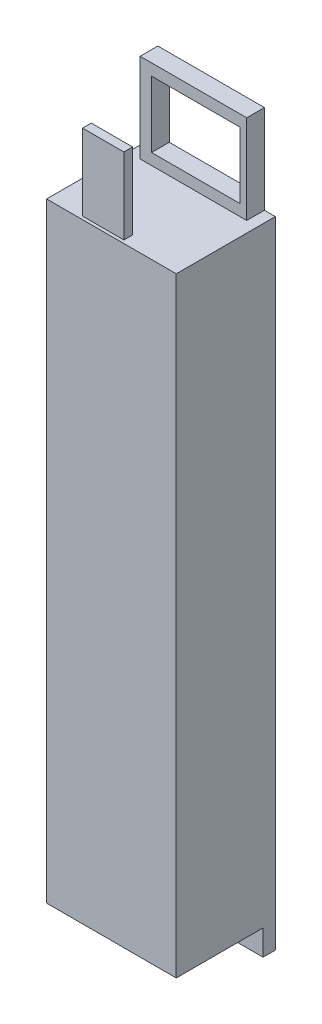
ISO-10303-21;
HEADER;
FILE_DESCRIPTION(('STEP AP214'),'2;1');
FILE_NAME('part.step','',(''),(''),'','','');
FILE_SCHEMA(('AUTOMOTIVE_DESIGN { 1 0 10303 214 1 1 1 1 }'));
ENDSEC;
DATA;
#1=APPLICATION_CONTEXT('core data for automotive mechanical design processes');
#2=APPLICATION_PROTOCOL_DEFINITION('international standard','automotive_design',2000,#1);
#3=PRODUCT_CONTEXT('',#1,'mechanical');
#4=PRODUCT('Part','Part','',(#3));
#5=PRODUCT_RELATED_PRODUCT_CATEGORY('part','',(#4));
#6=PRODUCT_DEFINITION_FORMATION('','',#4);
#7=PRODUCT_DEFINITION_CONTEXT('part definition',#1,'design');
#8=PRODUCT_DEFINITION('design','',#6,#7);
#9=PRODUCT_DEFINITION_SHAPE('','',#8);
#10=(LENGTH_UNIT() NAMED_UNIT(*) SI_UNIT(.MILLI.,.METRE.));
#11=(NAMED_UNIT(*) PLANE_ANGLE_UNIT() SI_UNIT($,.RADIAN.));
#12=(NAMED_UNIT(*) SI_UNIT($,.STERADIAN.) SOLID_ANGLE_UNIT());
#13=UNCERTAINTY_MEASURE_WITH_UNIT(LENGTH_MEASURE(1.E-05),#10,'distance_accuracy_value','');
#14=(GEOMETRIC_REPRESENTATION_CONTEXT(3) GLOBAL_UNCERTAINTY_ASSIGNED_CONTEXT((#13)) GLOBAL_UNIT_ASSIGNED_CONTEXT((#10,
#11,#12)) REPRESENTATION_CONTEXT('',''));
#15=CARTESIAN_POINT('',(0.,0.,0.));
#16=DIRECTION('',(0.,0.,1.));
#17=DIRECTION('',(1.,0.,0.));
#18=AXIS2_PLACEMENT_3D('',#15,#16,#17);
#19=CARTESIAN_POINT('',(0.,240.,0.));
#20=DIRECTION('',(0.,-1.,0.));
#21=DIRECTION('',(0.,0.,-1.));
#22=AXIS2_PLACEMENT_3D('',#19,#20,#21);
#23=PLANE('',#22);
#24=DIRECTION('',(0.,0.,1.));
#25=VECTOR('',#24,1.);
#26=CARTESIAN_POINT('',(4.74406737925317,240.,-39.));
#27=LINE('',#26,#25);
#28=CARTESIAN_POINT('',(4.74406737925317,240.,-39.));
#29=VERTEX_POINT('',#28);
#30=CARTESIAN_POINT('',(4.74406737925317,240.,-32.0288768712829));
#31=VERTEX_POINT('',#30);
#32=EDGE_CURVE('E307',#29,#31,#27,.T.);
#33=ORIENTED_EDGE('',*,*,#32,.F.);
#34=DIRECTION('',(-1.,0.,0.));
#35=VECTOR('',#34,1.);
#36=CARTESIAN_POINT('',(0.,240.,-39.));
#37=LINE('',#36,#35);
#38=CARTESIAN_POINT('',(0.,240.,-39.));
#39=VERTEX_POINT('',#38);
#40=EDGE_CURVE('E346',#29,#39,#37,.T.);
#41=ORIENTED_EDGE('',*,*,#40,.T.);
#42=DIRECTION('',(0.,0.,1.));
#43=VECTOR('',#42,1.);
#44=CARTESIAN_POINT('',(0.,240.,0.));
#45=LINE('',#44,#43);
#46=CARTESIAN_POINT('',(0.,240.,0.));
#47=VERTEX_POINT('',#46);
#48=EDGE_CURVE('E338',#39,#47,#45,.T.);
#49=ORIENTED_EDGE('',*,*,#48,.T.);
#50=DIRECTION('',(1.,0.,0.));
#51=VECTOR('',#50,1.);
#52=CARTESIAN_POINT('',(0.,240.,0.));
#53=LINE('',#52,#51);
#54=CARTESIAN_POINT('',(51.,240.,0.));
#55=VERTEX_POINT('',#54);
#56=EDGE_CURVE('E341',#47,#55,#53,.T.);
#57=ORIENTED_EDGE('',*,*,#56,.T.);
#58=DIRECTION('',(0.,0.,-1.));
#59=VECTOR('',#58,1.);
#60=CARTESIAN_POINT('',(51.,240.,0.));
#61=LINE('',#60,#59);
#62=CARTESIAN_POINT('',(51.,240.,-39.));
#63=VERTEX_POINT('',#62);
#64=EDGE_CURVE('E344',#55,#63,#61,.T.);
#65=ORIENTED_EDGE('',*,*,#64,.T.);
#66=CARTESIAN_POINT('',(46.7051872057842,240.,-39.));
#67=VERTEX_POINT('',#66);
#68=EDGE_CURVE('E347',#63,#67,#37,.T.);
#69=ORIENTED_EDGE('',*,*,#68,.T.);
#70=DIRECTION('',(0.,0.,-1.));
#71=VECTOR('',#70,1.);
#72=CARTESIAN_POINT('',(46.7051872057842,240.,-39.));
#73=LINE('',#72,#71);
#74=CARTESIAN_POINT('',(46.7051872057842,240.,-32.0288768712829));
#75=VERTEX_POINT('',#74);
#76=EDGE_CURVE('E312',#75,#67,#73,.T.);
#77=ORIENTED_EDGE('',*,*,#76,.F.);
#78=DIRECTION('',(1.,0.,0.));
#79=VECTOR('',#78,1.);
#80=CARTESIAN_POINT('',(4.74406737925317,240.,-32.0288768712829));
#81=LINE('',#80,#79);
#82=EDGE_CURVE('E321',#31,#75,#81,.T.);
#83=ORIENTED_EDGE('',*,*,#82,.F.);
#84=EDGE_LOOP('',(#33,#41,#49,#57,#65,#69,#77,#83));
#85=FACE_BOUND('',#84,.T.);
#86=DIRECTION('',(0.,0.,1.));
#87=VECTOR('',#86,1.);
#88=CARTESIAN_POINT('',(12.9316550173179,240.,-4.63691690325311));
#89=LINE('',#88,#87);
#90=CARTESIAN_POINT('',(12.9316550173179,240.,-4.63691690325311));
#91=VERTEX_POINT('',#90);
#92=CARTESIAN_POINT('',(12.9316550173179,240.,-1.21695908483622));
#93=VERTEX_POINT('',#92);
#94=EDGE_CURVE('E274',#91,#93,#89,.T.);
#95=ORIENTED_EDGE('',*,*,#94,.F.);
#96=DIRECTION('',(-1.,0.,0.));
#97=VECTOR('',#96,1.);
#98=CARTESIAN_POINT('',(12.9316550173179,240.,-4.63691690325311));
#99=LINE('',#98,#97);
#100=CARTESIAN_POINT('',(29.1764546547982,240.,-4.63691690325311));
#101=VERTEX_POINT('',#100);
#102=EDGE_CURVE('E279',#101,#91,#99,.T.);
#103=ORIENTED_EDGE('',*,*,#102,.F.);
#104=DIRECTION('',(0.,0.,-1.));
#105=VECTOR('',#104,1.);
#106=CARTESIAN_POINT('',(29.1764546547982,240.,-4.63691690325311));
#107=LINE('',#106,#105);
#108=CARTESIAN_POINT('',(29.1764546547982,240.,-1.21695908483622));
#109=VERTEX_POINT('',#108);
#110=EDGE_CURVE('E291',#109,#101,#107,.T.);
#111=ORIENTED_EDGE('',*,*,#110,.F.);
#112=DIRECTION('',(1.,0.,0.));
#113=VECTOR('',#112,1.);
#114=CARTESIAN_POINT('',(12.9316550173179,240.,-1.21695908483622));
#115=LINE('',#114,#113);
#116=EDGE_CURVE('E288',#93,#109,#115,.T.);
#117=ORIENTED_EDGE('',*,*,#116,.F.);
#118=EDGE_LOOP('',(#95,#103,#111,#117));
#119=FACE_BOUND('',#118,.T.);
#120=ADVANCED_FACE('F37',(#85,#119),#23,.F.);
#121=CARTESIAN_POINT('',(0.,240.,0.));
#122=DIRECTION('',(1.,0.,0.));
#123=DIRECTION('',(0.,0.,-1.));
#124=AXIS2_PLACEMENT_3D('',#121,#122,#123);
#125=PLANE('',#124);
#126=DIRECTION('',(0.,-1.,0.));
#127=VECTOR('',#126,1.);
#128=CARTESIAN_POINT('',(0.,240.,-39.));
#129=LINE('',#128,#127);
#130=CARTESIAN_POINT('',(0.,-10.,-39.));
#131=VERTEX_POINT('',#130);
#132=EDGE_CURVE('E349',#39,#131,#129,.T.);
#133=ORIENTED_EDGE('',*,*,#132,.T.);
#134=DIRECTION('',(0.,0.,-1.));
#135=VECTOR('',#134,1.);
#136=CARTESIAN_POINT('',(0.,-10.,-39.));
#137=LINE('',#136,#135);
#138=CARTESIAN_POINT('',(0.,-10.,-34.1582483120249));
#139=VERTEX_POINT('',#138);
#140=EDGE_CURVE('E256',#139,#131,#137,.T.);
#141=ORIENTED_EDGE('',*,*,#140,.F.);
#142=DIRECTION('',(0.,1.,0.));
#143=VECTOR('',#142,1.);
#144=CARTESIAN_POINT('',(0.,-10.,-34.1582483120249));
#145=LINE('',#144,#143);
#146=CARTESIAN_POINT('',(0.,0.,-34.1582483120249));
#147=VERTEX_POINT('',#146);
#148=EDGE_CURVE('E266',#139,#147,#145,.T.);
#149=ORIENTED_EDGE('',*,*,#148,.T.);
#150=DIRECTION('',(0.,0.,1.));
#151=VECTOR('',#150,1.);
#152=CARTESIAN_POINT('',(0.,0.,0.));
#153=LINE('',#152,#151);
#154=CARTESIAN_POINT('',(0.,0.,0.));
#155=VERTEX_POINT('',#154);
#156=EDGE_CURVE('E337',#147,#155,#153,.T.);
#157=ORIENTED_EDGE('',*,*,#156,.T.);
#158=DIRECTION('',(0.,-1.,0.));
#159=VECTOR('',#158,1.);
#160=CARTESIAN_POINT('',(0.,240.,0.));
#161=LINE('',#160,#159);
#162=EDGE_CURVE('E11',#47,#155,#161,.T.);
#163=ORIENTED_EDGE('',*,*,#162,.F.);
#164=ORIENTED_EDGE('',*,*,#48,.F.);
#165=EDGE_LOOP('',(#133,#141,#149,#157,#163,#164));
#166=FACE_BOUND('',#165,.T.);
#167=ADVANCED_FACE('F39',(#166),#125,.F.);
#168=CARTESIAN_POINT('',(0.,240.,0.));
#169=DIRECTION('',(0.,0.,-1.));
#170=DIRECTION('',(-1.,0.,0.));
#171=AXIS2_PLACEMENT_3D('',#168,#169,#170);
#172=PLANE('',#171);
#173=DIRECTION('',(1.,0.,0.));
#174=VECTOR('',#173,1.);
#175=CARTESIAN_POINT('',(0.,0.,0.));
#176=LINE('',#175,#174);
#177=CARTESIAN_POINT('',(51.,0.,0.));
#178=VERTEX_POINT('',#177);
#179=EDGE_CURVE('E351',#155,#178,#176,.T.);
#180=ORIENTED_EDGE('',*,*,#179,.T.);
#181=DIRECTION('',(0.,-1.,0.));
#182=VECTOR('',#181,1.);
#183=CARTESIAN_POINT('',(51.,240.,0.));
#184=LINE('',#183,#182);
#185=EDGE_CURVE('E45',#55,#178,#184,.T.);
#186=ORIENTED_EDGE('',*,*,#185,.F.);
#187=ORIENTED_EDGE('',*,*,#56,.F.);
#188=ORIENTED_EDGE('',*,*,#162,.T.);
#189=EDGE_LOOP('',(#180,#186,#187,#188));
#190=FACE_BOUND('',#189,.T.);
#191=ADVANCED_FACE('F417',(#190),#172,.F.);
#192=CARTESIAN_POINT('',(51.,240.,0.));
#193=DIRECTION('',(-1.,0.,0.));
#194=DIRECTION('',(0.,0.,1.));
#195=AXIS2_PLACEMENT_3D('',#192,#193,#194);
#196=PLANE('',#195);
#197=DIRECTION('',(0.,0.,-1.));
#198=VECTOR('',#197,1.);
#199=CARTESIAN_POINT('',(51.,0.,0.));
#200=LINE('',#199,#198);
#201=CARTESIAN_POINT('',(51.,0.,-34.1582483120249));
#202=VERTEX_POINT('',#201);
#203=EDGE_CURVE('E342',#178,#202,#200,.T.);
#204=ORIENTED_EDGE('',*,*,#203,.T.);
#205=DIRECTION('',(0.,1.,0.));
#206=VECTOR('',#205,1.);
#207=CARTESIAN_POINT('',(51.,-10.,-34.1582483120249));
#208=LINE('',#207,#206);
#209=CARTESIAN_POINT('',(51.,-10.,-34.1582483120249));
#210=VERTEX_POINT('',#209);
#211=EDGE_CURVE('E271',#210,#202,#208,.T.);
#212=ORIENTED_EDGE('',*,*,#211,.F.);
#213=DIRECTION('',(0.,0.,1.));
#214=VECTOR('',#213,1.);
#215=CARTESIAN_POINT('',(51.,-10.,-39.));
#216=LINE('',#215,#214);
#217=CARTESIAN_POINT('',(51.,-10.,-39.));
#218=VERTEX_POINT('',#217);
#219=EDGE_CURVE('E262',#218,#210,#216,.T.);
#220=ORIENTED_EDGE('',*,*,#219,.F.);
#221=DIRECTION('',(0.,-1.,0.));
#222=VECTOR('',#221,1.);
#223=CARTESIAN_POINT('',(51.,240.,-39.));
#224=LINE('',#223,#222);
#225=EDGE_CURVE('E356',#63,#218,#224,.T.);
#226=ORIENTED_EDGE('',*,*,#225,.F.);
#227=ORIENTED_EDGE('',*,*,#64,.F.);
#228=ORIENTED_EDGE('',*,*,#185,.T.);
#229=EDGE_LOOP('',(#204,#212,#220,#226,#227,#228));
#230=FACE_BOUND('',#229,.T.);
#231=ADVANCED_FACE('F362',(#230),#196,.F.);
#232=CARTESIAN_POINT('',(0.,240.,-39.));
#233=DIRECTION('',(0.,0.,1.));
#234=DIRECTION('',(1.,0.,0.));
#235=AXIS2_PLACEMENT_3D('',#232,#233,#234);
#236=PLANE('',#235);
#237=DIRECTION('',(-1.,0.,0.));
#238=VECTOR('',#237,1.);
#239=CARTESIAN_POINT('',(0.,270.477313293659,-39.));
#240=LINE('',#239,#238);
#241=CARTESIAN_POINT('',(43.9662368017553,270.477313293659,-39.));
#242=VERTEX_POINT('',#241);
#243=CARTESIAN_POINT('',(9.25073643361582,270.477313293659,-39.));
#244=VERTEX_POINT('',#243);
#245=EDGE_CURVE('E217',#242,#244,#240,.T.);
#246=ORIENTED_EDGE('',*,*,#245,.T.);
#247=DIRECTION('',(0.,-1.,0.));
#248=VECTOR('',#247,1.);
#249=CARTESIAN_POINT('',(9.25073643361582,240.,-39.));
#250=LINE('',#249,#248);
#251=CARTESIAN_POINT('',(9.25073643361582,244.440688017554,-39.));
#252=VERTEX_POINT('',#251);
#253=EDGE_CURVE('E220',#244,#252,#250,.T.);
#254=ORIENTED_EDGE('',*,*,#253,.T.);
#255=DIRECTION('',(1.,0.,0.));
#256=VECTOR('',#255,1.);
#257=CARTESIAN_POINT('',(0.,244.440688017554,-39.));
#258=LINE('',#257,#256);
#259=CARTESIAN_POINT('',(43.9662368017553,244.440688017554,-39.));
#260=VERTEX_POINT('',#259);
#261=EDGE_CURVE('E212',#252,#260,#258,.T.);
#262=ORIENTED_EDGE('',*,*,#261,.T.);
#263=DIRECTION('',(0.,1.,0.));
#264=VECTOR('',#263,1.);
#265=CARTESIAN_POINT('',(43.9662368017553,240.,-39.));
#266=LINE('',#265,#264);
#267=EDGE_CURVE('E192',#260,#242,#266,.T.);
#268=ORIENTED_EDGE('',*,*,#267,.T.);
#269=EDGE_LOOP('',(#246,#254,#262,#268));
#270=FACE_BOUND('',#269,.T.);
#271=ORIENTED_EDGE('',*,*,#225,.T.);
#272=DIRECTION('',(1.,0.,0.));
#273=VECTOR('',#272,1.);
#274=CARTESIAN_POINT('',(0.,-10.,-39.));
#275=LINE('',#274,#273);
#276=EDGE_CURVE('E259',#131,#218,#275,.T.);
#277=ORIENTED_EDGE('',*,*,#276,.F.);
#278=ORIENTED_EDGE('',*,*,#132,.F.);
#279=ORIENTED_EDGE('',*,*,#40,.F.);
#280=DIRECTION('',(0.,-1.,0.));
#281=VECTOR('',#280,1.);
#282=CARTESIAN_POINT('',(4.74406737925317,275.,-39.));
#283=LINE('',#282,#281);
#284=CARTESIAN_POINT('',(4.74406737925317,275.,-39.));
#285=VERTEX_POINT('',#284);
#286=EDGE_CURVE('E318',#285,#29,#283,.T.);
#287=ORIENTED_EDGE('',*,*,#286,.F.);
#288=DIRECTION('',(-1.,0.,0.));
#289=VECTOR('',#288,1.);
#290=CARTESIAN_POINT('',(4.74406737925317,275.,-39.));
#291=LINE('',#290,#289);
#292=CARTESIAN_POINT('',(46.7051872057842,275.,-39.));
#293=VERTEX_POINT('',#292);
#294=EDGE_CURVE('E316',#293,#285,#291,.T.);
#295=ORIENTED_EDGE('',*,*,#294,.F.);
#296=DIRECTION('',(0.,-1.,0.));
#297=VECTOR('',#296,1.);
#298=CARTESIAN_POINT('',(46.7051872057842,275.,-39.));
#299=LINE('',#298,#297);
#300=EDGE_CURVE('E328',#293,#67,#299,.T.);
#301=ORIENTED_EDGE('',*,*,#300,.T.);
#302=ORIENTED_EDGE('',*,*,#68,.F.);
#303=EDGE_LOOP('',(#271,#277,#278,#279,#287,#295,#301,#302));
#304=FACE_BOUND('',#303,.T.);
#305=ADVANCED_FACE('F384',(#270,#304),#236,.F.);
#306=CARTESIAN_POINT('',(0.,0.,0.));
#307=DIRECTION('',(0.,-1.,0.));
#308=DIRECTION('',(0.,0.,-1.));
#309=AXIS2_PLACEMENT_3D('',#306,#307,#308);
#310=PLANE('',#309);
#311=DIRECTION('',(0.,0.,-1.));
#312=VECTOR('',#311,1.);
#313=CARTESIAN_POINT('',(3.6149313862826,0.,-3.26174721843074));
#314=LINE('',#313,#312);
#315=CARTESIAN_POINT('',(3.6149313862826,0.,-3.26174721843074));
#316=VERTEX_POINT('',#315);
#317=CARTESIAN_POINT('',(3.6149313862826,0.,-32.2857954334143));
#318=VERTEX_POINT('',#317);
#319=EDGE_CURVE('E223',#316,#318,#314,.T.);
#320=ORIENTED_EDGE('',*,*,#319,.F.);
#321=DIRECTION('',(-1.,0.,0.));
#322=VECTOR('',#321,1.);
#323=CARTESIAN_POINT('',(3.6149313862826,0.,-3.26174721843074));
#324=LINE('',#323,#322);
#325=CARTESIAN_POINT('',(48.3213282335556,0.,-3.26174721843074));
#326=VERTEX_POINT('',#325);
#327=EDGE_CURVE('E228',#326,#316,#324,.T.);
#328=ORIENTED_EDGE('',*,*,#327,.F.);
#329=DIRECTION('',(0.,0.,1.));
#330=VECTOR('',#329,1.);
#331=CARTESIAN_POINT('',(48.3213282335556,0.,-3.26174721843074));
#332=LINE('',#331,#330);
#333=CARTESIAN_POINT('',(48.3213282335556,0.,-32.2857954334143));
#334=VERTEX_POINT('',#333);
#335=EDGE_CURVE('E242',#334,#326,#332,.T.);
#336=ORIENTED_EDGE('',*,*,#335,.F.);
#337=DIRECTION('',(1.,0.,0.));
#338=VECTOR('',#337,1.);
#339=CARTESIAN_POINT('',(3.6149313862826,0.,-32.2857954334143));
#340=LINE('',#339,#338);
#341=EDGE_CURVE('E239',#318,#334,#340,.T.);
#342=ORIENTED_EDGE('',*,*,#341,.F.);
#343=EDGE_LOOP('',(#320,#328,#336,#342));
#344=FACE_BOUND('',#343,.T.);
#345=DIRECTION('',(-1.,0.,0.));
#346=VECTOR('',#345,1.);
#347=CARTESIAN_POINT('',(0.,0.,-34.1582483120249));
#348=LINE('',#347,#346);
#349=EDGE_CURVE('E249',#202,#147,#348,.T.);
#350=ORIENTED_EDGE('',*,*,#349,.F.);
#351=ORIENTED_EDGE('',*,*,#203,.F.);
#352=ORIENTED_EDGE('',*,*,#179,.F.);
#353=ORIENTED_EDGE('',*,*,#156,.F.);
#354=EDGE_LOOP('',(#350,#351,#352,#353));
#355=FACE_BOUND('',#354,.T.);
#356=ADVANCED_FACE('F368',(#344,#355),#310,.T.);
#357=CARTESIAN_POINT('',(4.74406737925317,275.,-39.));
#358=DIRECTION('',(1.,0.,0.));
#359=DIRECTION('',(0.,0.,-1.));
#360=AXIS2_PLACEMENT_3D('',#357,#358,#359);
#361=PLANE('',#360);
#362=ORIENTED_EDGE('',*,*,#32,.T.);
#363=DIRECTION('',(0.,-1.,0.));
#364=VECTOR('',#363,1.);
#365=CARTESIAN_POINT('',(4.74406737925317,275.,-32.0288768712829));
#366=LINE('',#365,#364);
#367=CARTESIAN_POINT('',(4.74406737925317,275.,-32.0288768712829));
#368=VERTEX_POINT('',#367);
#369=EDGE_CURVE('E334',#368,#31,#366,.T.);
#370=ORIENTED_EDGE('',*,*,#369,.F.);
#371=DIRECTION('',(0.,0.,1.));
#372=VECTOR('',#371,1.);
#373=CARTESIAN_POINT('',(4.74406737925317,275.,-39.));
#374=LINE('',#373,#372);
#375=EDGE_CURVE('E308',#285,#368,#374,.T.);
#376=ORIENTED_EDGE('',*,*,#375,.F.);
#377=ORIENTED_EDGE('',*,*,#286,.T.);
#378=EDGE_LOOP('',(#362,#370,#376,#377));
#379=FACE_BOUND('',#378,.T.);
#380=ADVANCED_FACE('F398',(#379),#361,.F.);
#381=CARTESIAN_POINT('',(4.74406737925317,275.,-32.0288768712829));
#382=DIRECTION('',(0.,0.,-1.));
#383=DIRECTION('',(-1.,0.,0.));
#384=AXIS2_PLACEMENT_3D('',#381,#382,#383);
#385=PLANE('',#384);
#386=DIRECTION('',(1.,0.,0.));
#387=VECTOR('',#386,1.);
#388=CARTESIAN_POINT('',(9.25073643361582,244.440688017554,-32.0288768712829));
#389=LINE('',#388,#387);
#390=CARTESIAN_POINT('',(9.25073643361582,244.440688017554,-32.0288768712829));
#391=VERTEX_POINT('',#390);
#392=CARTESIAN_POINT('',(43.9662368017553,244.440688017554,-32.0288768712829));
#393=VERTEX_POINT('',#392);
#394=EDGE_CURVE('E198',#391,#393,#389,.T.);
#395=ORIENTED_EDGE('',*,*,#394,.F.);
#396=DIRECTION('',(0.,-1.,0.));
#397=VECTOR('',#396,1.);
#398=CARTESIAN_POINT('',(9.25073643361582,270.477313293659,-32.0288768712829));
#399=LINE('',#398,#397);
#400=CARTESIAN_POINT('',(9.25073643361582,270.477313293659,-32.0288768712829));
#401=VERTEX_POINT('',#400);
#402=EDGE_CURVE('E60',#401,#391,#399,.T.);
#403=ORIENTED_EDGE('',*,*,#402,.F.);
#404=DIRECTION('',(-1.,0.,0.));
#405=VECTOR('',#404,1.);
#406=CARTESIAN_POINT('',(9.25073643361582,270.477313293659,-32.0288768712829));
#407=LINE('',#406,#405);
#408=CARTESIAN_POINT('',(43.9662368017553,270.477313293659,-32.0288768712829));
#409=VERTEX_POINT('',#408);
#410=EDGE_CURVE('E205',#409,#401,#407,.T.);
#411=ORIENTED_EDGE('',*,*,#410,.F.);
#412=DIRECTION('',(0.,1.,0.));
#413=VECTOR('',#412,1.);
#414=CARTESIAN_POINT('',(43.9662368017553,270.477313293659,-32.0288768712829));
#415=LINE('',#414,#413);
#416=EDGE_CURVE('E189',#393,#409,#415,.T.);
#417=ORIENTED_EDGE('',*,*,#416,.F.);
#418=EDGE_LOOP('',(#395,#403,#411,#417));
#419=FACE_BOUND('',#418,.T.);
#420=ORIENTED_EDGE('',*,*,#82,.T.);
#421=DIRECTION('',(0.,-1.,0.));
#422=VECTOR('',#421,1.);
#423=CARTESIAN_POINT('',(46.7051872057842,275.,-32.0288768712829));
#424=LINE('',#423,#422);
#425=CARTESIAN_POINT('',(46.7051872057842,275.,-32.0288768712829));
#426=VERTEX_POINT('',#425);
#427=EDGE_CURVE('E331',#426,#75,#424,.T.);
#428=ORIENTED_EDGE('',*,*,#427,.F.);
#429=DIRECTION('',(1.,0.,0.));
#430=VECTOR('',#429,1.);
#431=CARTESIAN_POINT('',(4.74406737925317,275.,-32.0288768712829));
#432=LINE('',#431,#430);
#433=EDGE_CURVE('E311',#368,#426,#432,.T.);
#434=ORIENTED_EDGE('',*,*,#433,.F.);
#435=ORIENTED_EDGE('',*,*,#369,.T.);
#436=EDGE_LOOP('',(#420,#428,#434,#435));
#437=FACE_BOUND('',#436,.T.);
#438=ADVANCED_FACE('F202',(#419,#437),#385,.F.);
#439=CARTESIAN_POINT('',(46.7051872057842,275.,-39.));
#440=DIRECTION('',(-1.,0.,0.));
#441=DIRECTION('',(0.,0.,1.));
#442=AXIS2_PLACEMENT_3D('',#439,#440,#441);
#443=PLANE('',#442);
#444=ORIENTED_EDGE('',*,*,#76,.T.);
#445=ORIENTED_EDGE('',*,*,#300,.F.);
#446=DIRECTION('',(0.,0.,-1.));
#447=VECTOR('',#446,1.);
#448=CARTESIAN_POINT('',(46.7051872057842,275.,-39.));
#449=LINE('',#448,#447);
#450=EDGE_CURVE('E314',#426,#293,#449,.T.);
#451=ORIENTED_EDGE('',*,*,#450,.F.);
#452=ORIENTED_EDGE('',*,*,#427,.T.);
#453=EDGE_LOOP('',(#444,#445,#451,#452));
#454=FACE_BOUND('',#453,.T.);
#455=ADVANCED_FACE('F390',(#454),#443,.F.);
#456=CARTESIAN_POINT('',(0.,275.,0.));
#457=DIRECTION('',(0.,1.,0.));
#458=DIRECTION('',(0.,0.,1.));
#459=AXIS2_PLACEMENT_3D('',#456,#457,#458);
#460=PLANE('',#459);
#461=ORIENTED_EDGE('',*,*,#375,.T.);
#462=ORIENTED_EDGE('',*,*,#433,.T.);
#463=ORIENTED_EDGE('',*,*,#450,.T.);
#464=ORIENTED_EDGE('',*,*,#294,.T.);
#465=EDGE_LOOP('',(#461,#462,#463,#464));
#466=FACE_BOUND('',#465,.T.);
#467=ADVANCED_FACE('F400',(#466),#460,.T.);
#468=CARTESIAN_POINT('',(12.9316550173179,270.,-4.63691690325311));
#469=DIRECTION('',(1.,0.,0.));
#470=DIRECTION('',(0.,0.,-1.));
#471=AXIS2_PLACEMENT_3D('',#468,#469,#470);
#472=PLANE('',#471);
#473=ORIENTED_EDGE('',*,*,#94,.T.);
#474=DIRECTION('',(0.,-1.,0.));
#475=VECTOR('',#474,1.);
#476=CARTESIAN_POINT('',(12.9316550173179,270.,-1.21695908483622));
#477=LINE('',#476,#475);
#478=CARTESIAN_POINT('',(12.9316550173179,270.,-1.21695908483622));
#479=VERTEX_POINT('',#478);
#480=EDGE_CURVE('E304',#479,#93,#477,.T.);
#481=ORIENTED_EDGE('',*,*,#480,.F.);
#482=DIRECTION('',(0.,0.,1.));
#483=VECTOR('',#482,1.);
#484=CARTESIAN_POINT('',(12.9316550173179,270.,-4.63691690325311));
#485=LINE('',#484,#483);
#486=CARTESIAN_POINT('',(12.9316550173179,270.,-4.63691690325311));
#487=VERTEX_POINT('',#486);
#488=EDGE_CURVE('E275',#487,#479,#485,.T.);
#489=ORIENTED_EDGE('',*,*,#488,.F.);
#490=DIRECTION('',(0.,-1.,0.));
#491=VECTOR('',#490,1.);
#492=CARTESIAN_POINT('',(12.9316550173179,270.,-4.63691690325311));
#493=LINE('',#492,#491);
#494=EDGE_CURVE('E285',#487,#91,#493,.T.);
#495=ORIENTED_EDGE('',*,*,#494,.T.);
#496=EDGE_LOOP('',(#473,#481,#489,#495));
#497=FACE_BOUND('',#496,.T.);
#498=ADVANCED_FACE('F402',(#497),#472,.F.);
#499=CARTESIAN_POINT('',(12.9316550173179,270.,-1.21695908483622));
#500=DIRECTION('',(0.,0.,-1.));
#501=DIRECTION('',(-1.,0.,0.));
#502=AXIS2_PLACEMENT_3D('',#499,#500,#501);
#503=PLANE('',#502);
#504=ORIENTED_EDGE('',*,*,#116,.T.);
#505=DIRECTION('',(0.,-1.,0.));
#506=VECTOR('',#505,1.);
#507=CARTESIAN_POINT('',(29.1764546547982,270.,-1.21695908483622));
#508=LINE('',#507,#506);
#509=CARTESIAN_POINT('',(29.1764546547982,270.,-1.21695908483622));
#510=VERTEX_POINT('',#509);
#511=EDGE_CURVE('E301',#510,#109,#508,.T.);
#512=ORIENTED_EDGE('',*,*,#511,.F.);
#513=DIRECTION('',(1.,0.,0.));
#514=VECTOR('',#513,1.);
#515=CARTESIAN_POINT('',(12.9316550173179,270.,-1.21695908483622));
#516=LINE('',#515,#514);
#517=EDGE_CURVE('E278',#479,#510,#516,.T.);
#518=ORIENTED_EDGE('',*,*,#517,.F.);
#519=ORIENTED_EDGE('',*,*,#480,.T.);
#520=EDGE_LOOP('',(#504,#512,#518,#519));
#521=FACE_BOUND('',#520,.T.);
#522=ADVANCED_FACE('F408',(#521),#503,.F.);
#523=CARTESIAN_POINT('',(29.1764546547982,270.,-4.63691690325311));
#524=DIRECTION('',(-1.,0.,0.));
#525=DIRECTION('',(0.,0.,1.));
#526=AXIS2_PLACEMENT_3D('',#523,#524,#525);
#527=PLANE('',#526);
#528=ORIENTED_EDGE('',*,*,#110,.T.);
#529=DIRECTION('',(0.,-1.,0.));
#530=VECTOR('',#529,1.);
#531=CARTESIAN_POINT('',(29.1764546547982,270.,-4.63691690325311));
#532=LINE('',#531,#530);
#533=CARTESIAN_POINT('',(29.1764546547982,270.,-4.63691690325311));
#534=VERTEX_POINT('',#533);
#535=EDGE_CURVE('E298',#534,#101,#532,.T.);
#536=ORIENTED_EDGE('',*,*,#535,.F.);
#537=DIRECTION('',(0.,0.,-1.));
#538=VECTOR('',#537,1.);
#539=CARTESIAN_POINT('',(29.1764546547982,270.,-4.63691690325311));
#540=LINE('',#539,#538);
#541=EDGE_CURVE('E281',#510,#534,#540,.T.);
#542=ORIENTED_EDGE('',*,*,#541,.F.);
#543=ORIENTED_EDGE('',*,*,#511,.T.);
#544=EDGE_LOOP('',(#528,#536,#542,#543));
#545=FACE_BOUND('',#544,.T.);
#546=ADVANCED_FACE('F493',(#545),#527,.F.);
#547=CARTESIAN_POINT('',(12.9316550173179,270.,-4.63691690325311));
#548=DIRECTION('',(0.,0.,1.));
#549=DIRECTION('',(1.,0.,0.));
#550=AXIS2_PLACEMENT_3D('',#547,#548,#549);
#551=PLANE('',#550);
#552=ORIENTED_EDGE('',*,*,#102,.T.);
#553=ORIENTED_EDGE('',*,*,#494,.F.);
#554=DIRECTION('',(-1.,0.,0.));
#555=VECTOR('',#554,1.);
#556=CARTESIAN_POINT('',(12.9316550173179,270.,-4.63691690325311));
#557=LINE('',#556,#555);
#558=EDGE_CURVE('E283',#534,#487,#557,.T.);
#559=ORIENTED_EDGE('',*,*,#558,.F.);
#560=ORIENTED_EDGE('',*,*,#535,.T.);
#561=EDGE_LOOP('',(#552,#553,#559,#560));
#562=FACE_BOUND('',#561,.T.);
#563=ADVANCED_FACE('F503',(#562),#551,.F.);
#564=CARTESIAN_POINT('',(0.,270.,0.));
#565=DIRECTION('',(0.,1.,0.));
#566=DIRECTION('',(0.,0.,1.));
#567=AXIS2_PLACEMENT_3D('',#564,#565,#566);
#568=PLANE('',#567);
#569=ORIENTED_EDGE('',*,*,#488,.T.);
#570=ORIENTED_EDGE('',*,*,#517,.T.);
#571=ORIENTED_EDGE('',*,*,#541,.T.);
#572=ORIENTED_EDGE('',*,*,#558,.T.);
#573=EDGE_LOOP('',(#569,#570,#571,#572));
#574=FACE_BOUND('',#573,.T.);
#575=ADVANCED_FACE('F513',(#574),#568,.T.);
#576=CARTESIAN_POINT('',(0.,-10.,-34.1582483120249));
#577=DIRECTION('',(0.,0.,-1.));
#578=DIRECTION('',(-1.,0.,0.));
#579=AXIS2_PLACEMENT_3D('',#576,#577,#578);
#580=PLANE('',#579);
#581=ORIENTED_EDGE('',*,*,#349,.T.);
#582=ORIENTED_EDGE('',*,*,#148,.F.);
#583=DIRECTION('',(-1.,0.,0.));
#584=VECTOR('',#583,1.);
#585=CARTESIAN_POINT('',(0.,-10.,-34.1582483120249));
#586=LINE('',#585,#584);
#587=EDGE_CURVE('E264',#210,#139,#586,.T.);
#588=ORIENTED_EDGE('',*,*,#587,.F.);
#589=ORIENTED_EDGE('',*,*,#211,.T.);
#590=EDGE_LOOP('',(#581,#582,#588,#589));
#591=FACE_BOUND('',#590,.T.);
#592=ADVANCED_FACE('F371',(#591),#580,.F.);
#593=CARTESIAN_POINT('',(0.,-10.,0.));
#594=DIRECTION('',(0.,1.,0.));
#595=DIRECTION('',(0.,0.,1.));
#596=AXIS2_PLACEMENT_3D('',#593,#594,#595);
#597=PLANE('',#596);
#598=ORIENTED_EDGE('',*,*,#140,.T.);
#599=ORIENTED_EDGE('',*,*,#276,.T.);
#600=ORIENTED_EDGE('',*,*,#219,.T.);
#601=ORIENTED_EDGE('',*,*,#587,.T.);
#602=EDGE_LOOP('',(#598,#599,#600,#601));
#603=FACE_BOUND('',#602,.T.);
#604=ADVANCED_FACE('F380',(#603),#597,.F.);
#605=CARTESIAN_POINT('',(3.6149313862826,10.,-3.26174721843074));
#606=DIRECTION('',(-1.,0.,0.));
#607=DIRECTION('',(0.,0.,1.));
#608=AXIS2_PLACEMENT_3D('',#605,#606,#607);
#609=PLANE('',#608);
#610=ORIENTED_EDGE('',*,*,#319,.T.);
#611=DIRECTION('',(0.,-1.,0.));
#612=VECTOR('',#611,1.);
#613=CARTESIAN_POINT('',(3.6149313862826,10.,-32.2857954334143));
#614=LINE('',#613,#612);
#615=CARTESIAN_POINT('',(3.6149313862826,10.,-32.2857954334143));
#616=VERTEX_POINT('',#615);
#617=EDGE_CURVE('E237',#616,#318,#614,.T.);
#618=ORIENTED_EDGE('',*,*,#617,.F.);
#619=DIRECTION('',(0.,0.,-1.));
#620=VECTOR('',#619,1.);
#621=CARTESIAN_POINT('',(3.6149313862826,10.,-3.26174721843074));
#622=LINE('',#621,#620);
#623=CARTESIAN_POINT('',(3.6149313862826,10.,-3.26174721843074));
#624=VERTEX_POINT('',#623);
#625=EDGE_CURVE('E224',#624,#616,#622,.T.);
#626=ORIENTED_EDGE('',*,*,#625,.F.);
#627=DIRECTION('',(0.,-1.,0.));
#628=VECTOR('',#627,1.);
#629=CARTESIAN_POINT('',(3.6149313862826,10.,-3.26174721843074));
#630=LINE('',#629,#628);
#631=EDGE_CURVE('E247',#624,#316,#630,.T.);
#632=ORIENTED_EDGE('',*,*,#631,.T.);
#633=EDGE_LOOP('',(#610,#618,#626,#632));
#634=FACE_BOUND('',#633,.T.);
#635=ADVANCED_FACE('F557',(#634),#609,.F.);
#636=CARTESIAN_POINT('',(3.6149313862826,10.,-3.26174721843074));
#637=DIRECTION('',(0.,0.,1.));
#638=DIRECTION('',(1.,0.,0.));
#639=AXIS2_PLACEMENT_3D('',#636,#637,#638);
#640=PLANE('',#639);
#641=ORIENTED_EDGE('',*,*,#327,.T.);
#642=ORIENTED_EDGE('',*,*,#631,.F.);
#643=DIRECTION('',(-1.,0.,0.));
#644=VECTOR('',#643,1.);
#645=CARTESIAN_POINT('',(3.6149313862826,10.,-3.26174721843074));
#646=LINE('',#645,#644);
#647=CARTESIAN_POINT('',(48.3213282335556,10.,-3.26174721843074));
#648=VERTEX_POINT('',#647);
#649=EDGE_CURVE('E234',#648,#624,#646,.T.);
#650=ORIENTED_EDGE('',*,*,#649,.F.);
#651=DIRECTION('',(0.,-1.,0.));
#652=VECTOR('',#651,1.);
#653=CARTESIAN_POINT('',(48.3213282335556,10.,-3.26174721843074));
#654=LINE('',#653,#652);
#655=EDGE_CURVE('E250',#648,#326,#654,.T.);
#656=ORIENTED_EDGE('',*,*,#655,.T.);
#657=EDGE_LOOP('',(#641,#642,#650,#656));
#658=FACE_BOUND('',#657,.T.);
#659=ADVANCED_FACE('F563',(#658),#640,.F.);
#660=CARTESIAN_POINT('',(48.3213282335556,10.,-3.26174721843074));
#661=DIRECTION('',(1.,0.,0.));
#662=DIRECTION('',(0.,0.,-1.));
#663=AXIS2_PLACEMENT_3D('',#660,#661,#662);
#664=PLANE('',#663);
#665=ORIENTED_EDGE('',*,*,#335,.T.);
#666=ORIENTED_EDGE('',*,*,#655,.F.);
#667=DIRECTION('',(0.,0.,1.));
#668=VECTOR('',#667,1.);
#669=CARTESIAN_POINT('',(48.3213282335556,10.,-3.26174721843074));
#670=LINE('',#669,#668);
#671=CARTESIAN_POINT('',(48.3213282335556,10.,-32.2857954334143));
#672=VERTEX_POINT('',#671);
#673=EDGE_CURVE('E231',#672,#648,#670,.T.);
#674=ORIENTED_EDGE('',*,*,#673,.F.);
#675=DIRECTION('',(0.,-1.,0.));
#676=VECTOR('',#675,1.);
#677=CARTESIAN_POINT('',(48.3213282335556,10.,-32.2857954334143));
#678=LINE('',#677,#676);
#679=EDGE_CURVE('E252',#672,#334,#678,.T.);
#680=ORIENTED_EDGE('',*,*,#679,.T.);
#681=EDGE_LOOP('',(#665,#666,#674,#680));
#682=FACE_BOUND('',#681,.T.);
#683=ADVANCED_FACE('F571',(#682),#664,.F.);
#684=CARTESIAN_POINT('',(3.6149313862826,10.,-32.2857954334143));
#685=DIRECTION('',(0.,0.,-1.));
#686=DIRECTION('',(-1.,0.,0.));
#687=AXIS2_PLACEMENT_3D('',#684,#685,#686);
#688=PLANE('',#687);
#689=ORIENTED_EDGE('',*,*,#341,.T.);
#690=ORIENTED_EDGE('',*,*,#679,.F.);
#691=DIRECTION('',(1.,0.,0.));
#692=VECTOR('',#691,1.);
#693=CARTESIAN_POINT('',(3.6149313862826,10.,-32.2857954334143));
#694=LINE('',#693,#692);
#695=EDGE_CURVE('E227',#616,#672,#694,.T.);
#696=ORIENTED_EDGE('',*,*,#695,.F.);
#697=ORIENTED_EDGE('',*,*,#617,.T.);
#698=EDGE_LOOP('',(#689,#690,#696,#697));
#699=FACE_BOUND('',#698,.T.);
#700=ADVANCED_FACE('F579',(#699),#688,.F.);
#701=CARTESIAN_POINT('',(0.,10.,0.));
#702=DIRECTION('',(0.,-1.,0.));
#703=DIRECTION('',(0.,0.,-1.));
#704=AXIS2_PLACEMENT_3D('',#701,#702,#703);
#705=PLANE('',#704);
#706=ORIENTED_EDGE('',*,*,#625,.T.);
#707=ORIENTED_EDGE('',*,*,#695,.T.);
#708=ORIENTED_EDGE('',*,*,#673,.T.);
#709=ORIENTED_EDGE('',*,*,#649,.T.);
#710=EDGE_LOOP('',(#706,#707,#708,#709));
#711=FACE_BOUND('',#710,.T.);
#712=ADVANCED_FACE('F587',(#711),#705,.T.);
#713=CARTESIAN_POINT('',(9.25073643361582,270.477313293659,-42.0288768712829));
#714=DIRECTION('',(-1.,0.,0.));
#715=DIRECTION('',(0.,0.,1.));
#716=AXIS2_PLACEMENT_3D('',#713,#714,#715);
#717=PLANE('',#716);
#718=DIRECTION('',(0.,0.,1.));
#719=VECTOR('',#718,1.);
#720=CARTESIAN_POINT('',(9.25073643361582,270.477313293659,-42.0288768712829));
#721=LINE('',#720,#719);
#722=EDGE_CURVE('E210',#244,#401,#721,.T.);
#723=ORIENTED_EDGE('',*,*,#722,.T.);
#724=ORIENTED_EDGE('',*,*,#402,.T.);
#725=DIRECTION('',(0.,0.,1.));
#726=VECTOR('',#725,1.);
#727=CARTESIAN_POINT('',(9.25073643361582,244.440688017554,-42.0288768712829));
#728=LINE('',#727,#726);
#729=EDGE_CURVE('E195',#252,#391,#728,.T.);
#730=ORIENTED_EDGE('',*,*,#729,.F.);
#731=ORIENTED_EDGE('',*,*,#253,.F.);
#732=EDGE_LOOP('',(#723,#724,#730,#731));
#733=FACE_BOUND('',#732,.T.);
#734=ADVANCED_FACE('F594',(#733),#717,.F.);
#735=CARTESIAN_POINT('',(9.25073643361582,270.477313293659,-42.0288768712829));
#736=DIRECTION('',(0.,1.,0.));
#737=DIRECTION('',(0.,0.,1.));
#738=AXIS2_PLACEMENT_3D('',#735,#736,#737);
#739=PLANE('',#738);
#740=DIRECTION('',(0.,0.,1.));
#741=VECTOR('',#740,1.);
#742=CARTESIAN_POINT('',(43.9662368017553,270.477313293659,-42.0288768712829));
#743=LINE('',#742,#741);
#744=EDGE_CURVE('E194',#242,#409,#743,.T.);
#745=ORIENTED_EDGE('',*,*,#744,.T.);
#746=ORIENTED_EDGE('',*,*,#410,.T.);
#747=ORIENTED_EDGE('',*,*,#722,.F.);
#748=ORIENTED_EDGE('',*,*,#245,.F.);
#749=EDGE_LOOP('',(#745,#746,#747,#748));
#750=FACE_BOUND('',#749,.T.);
#751=ADVANCED_FACE('F601',(#750),#739,.F.);
#752=CARTESIAN_POINT('',(43.9662368017553,270.477313293659,-42.0288768712829));
#753=DIRECTION('',(1.,0.,0.));
#754=DIRECTION('',(0.,0.,-1.));
#755=AXIS2_PLACEMENT_3D('',#752,#753,#754);
#756=PLANE('',#755);
#757=DIRECTION('',(0.,0.,1.));
#758=VECTOR('',#757,1.);
#759=CARTESIAN_POINT('',(43.9662368017553,244.440688017554,-42.0288768712829));
#760=LINE('',#759,#758);
#761=EDGE_CURVE('E52',#260,#393,#760,.T.);
#762=ORIENTED_EDGE('',*,*,#761,.T.);
#763=ORIENTED_EDGE('',*,*,#416,.T.);
#764=ORIENTED_EDGE('',*,*,#744,.F.);
#765=ORIENTED_EDGE('',*,*,#267,.F.);
#766=EDGE_LOOP('',(#762,#763,#764,#765));
#767=FACE_BOUND('',#766,.T.);
#768=ADVANCED_FACE('F186',(#767),#756,.F.);
#769=CARTESIAN_POINT('',(9.25073643361582,244.440688017554,-42.0288768712829));
#770=DIRECTION('',(0.,-1.,0.));
#771=DIRECTION('',(0.,0.,-1.));
#772=AXIS2_PLACEMENT_3D('',#769,#770,#771);
#773=PLANE('',#772);
#774=ORIENTED_EDGE('',*,*,#729,.T.);
#775=ORIENTED_EDGE('',*,*,#394,.T.);
#776=ORIENTED_EDGE('',*,*,#761,.F.);
#777=ORIENTED_EDGE('',*,*,#261,.F.);
#778=EDGE_LOOP('',(#774,#775,#776,#777));
#779=FACE_BOUND('',#778,.T.);
#780=ADVANCED_FACE('F199',(#779),#773,.F.);
#781=CLOSED_SHELL('',(#120,#167,#191,#231,#305,#356,#380,#438,#455,#467,#498,#522,#546,#563,
#575,#592,#604,#635,#659,#683,#700,#712,#734,#751,#768,#780));
#782=MANIFOLD_SOLID_BREP('B2',#781);
#783=ADVANCED_BREP_SHAPE_REPRESENTATION('',(#18,#782),#14);
#784=SHAPE_DEFINITION_REPRESENTATION(#9,#783);
ENDSEC;
END-ISO-10303-21;
